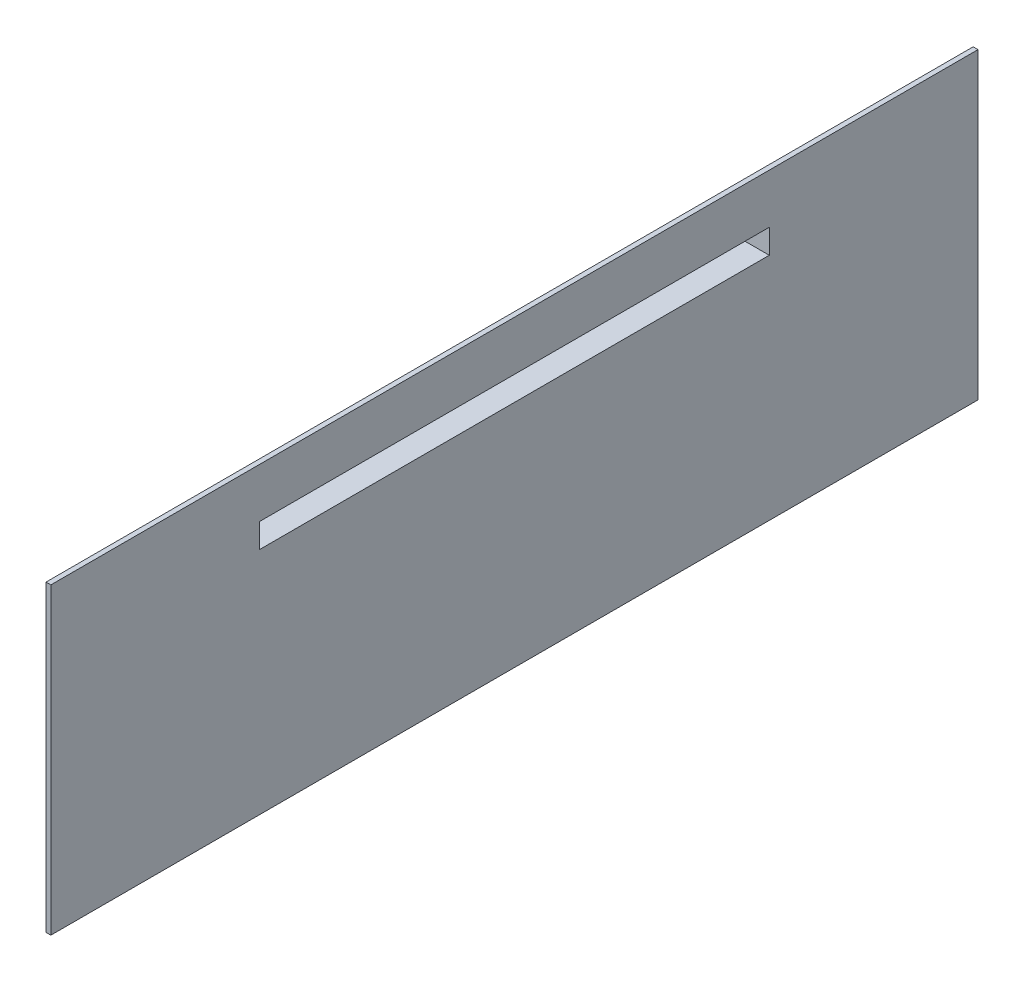
ISO-10303-21;
HEADER;
FILE_DESCRIPTION(('STEP AP214'),'2;1');
FILE_NAME('part.step','',(''),(''),'','','');
FILE_SCHEMA(('AUTOMOTIVE_DESIGN { 1 0 10303 214 1 1 1 1 }'));
ENDSEC;
DATA;
#1=APPLICATION_CONTEXT('core data for automotive mechanical design processes');
#2=APPLICATION_PROTOCOL_DEFINITION('international standard','automotive_design',2000,#1);
#3=PRODUCT_CONTEXT('',#1,'mechanical');
#4=PRODUCT('Part','Part','',(#3));
#5=PRODUCT_RELATED_PRODUCT_CATEGORY('part','',(#4));
#6=PRODUCT_DEFINITION_FORMATION('','',#4);
#7=PRODUCT_DEFINITION_CONTEXT('part definition',#1,'design');
#8=PRODUCT_DEFINITION('design','',#6,#7);
#9=PRODUCT_DEFINITION_SHAPE('','',#8);
#10=(LENGTH_UNIT() NAMED_UNIT(*) SI_UNIT(.MILLI.,.METRE.));
#11=(NAMED_UNIT(*) PLANE_ANGLE_UNIT() SI_UNIT($,.RADIAN.));
#12=(NAMED_UNIT(*) SI_UNIT($,.STERADIAN.) SOLID_ANGLE_UNIT());
#13=UNCERTAINTY_MEASURE_WITH_UNIT(LENGTH_MEASURE(1.E-05),#10,'distance_accuracy_value','');
#14=(GEOMETRIC_REPRESENTATION_CONTEXT(3) GLOBAL_UNCERTAINTY_ASSIGNED_CONTEXT((#13)) GLOBAL_UNIT_ASSIGNED_CONTEXT((#10,
#11,#12)) REPRESENTATION_CONTEXT('',''));
#15=CARTESIAN_POINT('',(0.,0.,0.));
#16=DIRECTION('',(0.,0.,1.));
#17=DIRECTION('',(1.,0.,0.));
#18=AXIS2_PLACEMENT_3D('',#15,#16,#17);
#19=CARTESIAN_POINT('',(532.,0.,0.));
#20=DIRECTION('',(-1.,0.,0.));
#21=DIRECTION('',(0.,0.,1.));
#22=AXIS2_PLACEMENT_3D('',#19,#20,#21);
#23=PLANE('',#22);
#24=DIRECTION('',(0.,0.,1.));
#25=VECTOR('',#24,1.);
#26=CARTESIAN_POINT('',(532.,-75.,-382.));
#27=LINE('',#26,#25);
#28=CARTESIAN_POINT('',(532.,-75.,-382.));
#29=VERTEX_POINT('',#28);
#30=CARTESIAN_POINT('',(532.,-75.,0.));
#31=VERTEX_POINT('',#30);
#32=EDGE_CURVE('E191',#29,#31,#27,.T.);
#33=ORIENTED_EDGE('',*,*,#32,.T.);
#34=DIRECTION('',(0.,1.,0.));
#35=VECTOR('',#34,1.);
#36=CARTESIAN_POINT('',(532.,-75.,0.));
#37=LINE('',#36,#35);
#38=CARTESIAN_POINT('',(532.,50.,0.));
#39=VERTEX_POINT('',#38);
#40=EDGE_CURVE('E207',#31,#39,#37,.T.);
#41=ORIENTED_EDGE('',*,*,#40,.T.);
#42=DIRECTION('',(0.,0.,-1.));
#43=VECTOR('',#42,1.);
#44=CARTESIAN_POINT('',(532.,50.,0.));
#45=LINE('',#44,#43);
#46=CARTESIAN_POINT('',(532.,50.,-382.));
#47=VERTEX_POINT('',#46);
#48=EDGE_CURVE('E210',#39,#47,#45,.T.);
#49=ORIENTED_EDGE('',*,*,#48,.T.);
#50=DIRECTION('',(0.,-1.,0.));
#51=VECTOR('',#50,1.);
#52=CARTESIAN_POINT('',(532.,50.,-382.));
#53=LINE('',#52,#51);
#54=EDGE_CURVE('E196',#47,#29,#53,.T.);
#55=ORIENTED_EDGE('',*,*,#54,.T.);
#56=EDGE_LOOP('',(#33,#41,#49,#55));
#57=FACE_BOUND('',#56,.T.);
#58=DIRECTION('',(0.,-1.,0.));
#59=VECTOR('',#58,1.);
#60=CARTESIAN_POINT('',(532.,16.6136570588009,-299.));
#61=LINE('',#60,#59);
#62=CARTESIAN_POINT('',(532.,32.6136570588009,-299.));
#63=VERTEX_POINT('',#62);
#64=CARTESIAN_POINT('',(532.,16.6136570588009,-299.));
#65=VERTEX_POINT('',#64);
#66=EDGE_CURVE('E176',#63,#65,#61,.T.);
#67=ORIENTED_EDGE('',*,*,#66,.F.);
#68=DIRECTION('',(0.,0.,-1.));
#69=VECTOR('',#68,1.);
#70=CARTESIAN_POINT('',(532.,32.6136570588009,-299.));
#71=LINE('',#70,#69);
#72=CARTESIAN_POINT('',(532.,32.6136570588009,-83.));
#73=VERTEX_POINT('',#72);
#74=EDGE_CURVE('E159',#73,#63,#71,.T.);
#75=ORIENTED_EDGE('',*,*,#74,.F.);
#76=DIRECTION('',(0.,1.,0.));
#77=VECTOR('',#76,1.);
#78=CARTESIAN_POINT('',(532.,32.6136570588009,-83.));
#79=LINE('',#78,#77);
#80=CARTESIAN_POINT('',(532.,16.6136570588009,-83.));
#81=VERTEX_POINT('',#80);
#82=EDGE_CURVE('E167',#81,#73,#79,.T.);
#83=ORIENTED_EDGE('',*,*,#82,.F.);
#84=DIRECTION('',(0.,0.,1.));
#85=VECTOR('',#84,1.);
#86=CARTESIAN_POINT('',(532.,16.6136570588009,-83.));
#87=LINE('',#86,#85);
#88=EDGE_CURVE('E178',#65,#81,#87,.T.);
#89=ORIENTED_EDGE('',*,*,#88,.F.);
#90=EDGE_LOOP('',(#67,#75,#83,#89));
#91=FACE_BOUND('',#90,.T.);
#92=ADVANCED_FACE('F36',(#57,#91),#23,.T.);
#93=CARTESIAN_POINT('',(534.,-75.,-382.));
#94=DIRECTION('',(0.,-1.,0.));
#95=DIRECTION('',(0.,0.,-1.));
#96=AXIS2_PLACEMENT_3D('',#93,#94,#95);
#97=PLANE('',#96);
#98=ORIENTED_EDGE('',*,*,#32,.F.);
#99=DIRECTION('',(-1.,0.,0.));
#100=VECTOR('',#99,1.);
#101=CARTESIAN_POINT('',(534.,-75.,-382.));
#102=LINE('',#101,#100);
#103=CARTESIAN_POINT('',(534.,-75.,-382.));
#104=VERTEX_POINT('',#103);
#105=EDGE_CURVE('E11',#104,#29,#102,.T.);
#106=ORIENTED_EDGE('',*,*,#105,.F.);
#107=DIRECTION('',(0.,0.,1.));
#108=VECTOR('',#107,1.);
#109=CARTESIAN_POINT('',(534.,-75.,-382.));
#110=LINE('',#109,#108);
#111=CARTESIAN_POINT('',(534.,-75.,0.));
#112=VERTEX_POINT('',#111);
#113=EDGE_CURVE('E192',#104,#112,#110,.T.);
#114=ORIENTED_EDGE('',*,*,#113,.T.);
#115=DIRECTION('',(-1.,0.,0.));
#116=VECTOR('',#115,1.);
#117=CARTESIAN_POINT('',(534.,-75.,0.));
#118=LINE('',#117,#116);
#119=EDGE_CURVE('E40',#112,#31,#118,.T.);
#120=ORIENTED_EDGE('',*,*,#119,.T.);
#121=EDGE_LOOP('',(#98,#106,#114,#120));
#122=FACE_BOUND('',#121,.T.);
#123=ADVANCED_FACE('F38',(#122),#97,.T.);
#124=CARTESIAN_POINT('',(534.,50.,-382.));
#125=DIRECTION('',(0.,0.,-1.));
#126=DIRECTION('',(-1.,0.,0.));
#127=AXIS2_PLACEMENT_3D('',#124,#125,#126);
#128=PLANE('',#127);
#129=ORIENTED_EDGE('',*,*,#54,.F.);
#130=DIRECTION('',(-1.,0.,0.));
#131=VECTOR('',#130,1.);
#132=CARTESIAN_POINT('',(534.,50.,-382.));
#133=LINE('',#132,#131);
#134=CARTESIAN_POINT('',(534.,50.,-382.));
#135=VERTEX_POINT('',#134);
#136=EDGE_CURVE('E45',#135,#47,#133,.T.);
#137=ORIENTED_EDGE('',*,*,#136,.F.);
#138=DIRECTION('',(0.,-1.,0.));
#139=VECTOR('',#138,1.);
#140=CARTESIAN_POINT('',(534.,50.,-382.));
#141=LINE('',#140,#139);
#142=EDGE_CURVE('E202',#135,#104,#141,.T.);
#143=ORIENTED_EDGE('',*,*,#142,.T.);
#144=ORIENTED_EDGE('',*,*,#105,.T.);
#145=EDGE_LOOP('',(#129,#137,#143,#144));
#146=FACE_BOUND('',#145,.T.);
#147=ADVANCED_FACE('F228',(#146),#128,.T.);
#148=CARTESIAN_POINT('',(534.,50.,0.));
#149=DIRECTION('',(0.,1.,0.));
#150=DIRECTION('',(0.,0.,1.));
#151=AXIS2_PLACEMENT_3D('',#148,#149,#150);
#152=PLANE('',#151);
#153=ORIENTED_EDGE('',*,*,#48,.F.);
#154=DIRECTION('',(-1.,0.,0.));
#155=VECTOR('',#154,1.);
#156=CARTESIAN_POINT('',(534.,50.,0.));
#157=LINE('',#156,#155);
#158=CARTESIAN_POINT('',(534.,50.,0.));
#159=VERTEX_POINT('',#158);
#160=EDGE_CURVE('E215',#159,#39,#157,.T.);
#161=ORIENTED_EDGE('',*,*,#160,.F.);
#162=DIRECTION('',(0.,0.,-1.));
#163=VECTOR('',#162,1.);
#164=CARTESIAN_POINT('',(534.,50.,0.));
#165=LINE('',#164,#163);
#166=EDGE_CURVE('E199',#159,#135,#165,.T.);
#167=ORIENTED_EDGE('',*,*,#166,.T.);
#168=ORIENTED_EDGE('',*,*,#136,.T.);
#169=EDGE_LOOP('',(#153,#161,#167,#168));
#170=FACE_BOUND('',#169,.T.);
#171=ADVANCED_FACE('F232',(#170),#152,.T.);
#172=CARTESIAN_POINT('',(534.,-75.,0.));
#173=DIRECTION('',(0.,0.,1.));
#174=DIRECTION('',(1.,0.,0.));
#175=AXIS2_PLACEMENT_3D('',#172,#173,#174);
#176=PLANE('',#175);
#177=ORIENTED_EDGE('',*,*,#40,.F.);
#178=ORIENTED_EDGE('',*,*,#119,.F.);
#179=DIRECTION('',(0.,1.,0.));
#180=VECTOR('',#179,1.);
#181=CARTESIAN_POINT('',(534.,-75.,0.));
#182=LINE('',#181,#180);
#183=EDGE_CURVE('E195',#112,#159,#182,.T.);
#184=ORIENTED_EDGE('',*,*,#183,.T.);
#185=ORIENTED_EDGE('',*,*,#160,.T.);
#186=EDGE_LOOP('',(#177,#178,#184,#185));
#187=FACE_BOUND('',#186,.T.);
#188=ADVANCED_FACE('F223',(#187),#176,.T.);
#189=CARTESIAN_POINT('',(534.,0.,0.));
#190=DIRECTION('',(-1.,0.,0.));
#191=DIRECTION('',(0.,0.,1.));
#192=AXIS2_PLACEMENT_3D('',#189,#190,#191);
#193=PLANE('',#192);
#194=DIRECTION('',(0.,1.,0.));
#195=VECTOR('',#194,1.);
#196=CARTESIAN_POINT('',(534.,19.6136570588009,-86.));
#197=LINE('',#196,#195);
#198=CARTESIAN_POINT('',(534.,19.6136570588009,-86.));
#199=VERTEX_POINT('',#198);
#200=CARTESIAN_POINT('',(534.,29.6136570588009,-86.));
#201=VERTEX_POINT('',#200);
#202=EDGE_CURVE('E134',#199,#201,#197,.T.);
#203=ORIENTED_EDGE('',*,*,#202,.T.);
#204=DIRECTION('',(0.,0.,-1.));
#205=VECTOR('',#204,1.);
#206=CARTESIAN_POINT('',(534.,29.6136570588009,-86.));
#207=LINE('',#206,#205);
#208=CARTESIAN_POINT('',(534.,29.6136570588009,-296.));
#209=VERTEX_POINT('',#208);
#210=EDGE_CURVE('E128',#201,#209,#207,.T.);
#211=ORIENTED_EDGE('',*,*,#210,.T.);
#212=DIRECTION('',(0.,-1.,0.));
#213=VECTOR('',#212,1.);
#214=CARTESIAN_POINT('',(534.,29.6136570588009,-296.));
#215=LINE('',#214,#213);
#216=CARTESIAN_POINT('',(534.,19.6136570588009,-296.));
#217=VERTEX_POINT('',#216);
#218=EDGE_CURVE('E137',#209,#217,#215,.T.);
#219=ORIENTED_EDGE('',*,*,#218,.T.);
#220=DIRECTION('',(0.,0.,1.));
#221=VECTOR('',#220,1.);
#222=CARTESIAN_POINT('',(534.,19.6136570588009,-296.));
#223=LINE('',#222,#221);
#224=EDGE_CURVE('E53',#217,#199,#223,.T.);
#225=ORIENTED_EDGE('',*,*,#224,.T.);
#226=EDGE_LOOP('',(#203,#211,#219,#225));
#227=FACE_BOUND('',#226,.T.);
#228=ORIENTED_EDGE('',*,*,#113,.F.);
#229=ORIENTED_EDGE('',*,*,#142,.F.);
#230=ORIENTED_EDGE('',*,*,#166,.F.);
#231=ORIENTED_EDGE('',*,*,#183,.F.);
#232=EDGE_LOOP('',(#228,#229,#230,#231));
#233=FACE_BOUND('',#232,.T.);
#234=ADVANCED_FACE('F141',(#227,#233),#193,.F.);
#235=CARTESIAN_POINT('',(522.,32.6136570588009,-299.));
#236=DIRECTION('',(0.,-1.,0.));
#237=DIRECTION('',(0.,0.,-1.));
#238=AXIS2_PLACEMENT_3D('',#235,#236,#237);
#239=PLANE('',#238);
#240=ORIENTED_EDGE('',*,*,#74,.T.);
#241=DIRECTION('',(1.,0.,0.));
#242=VECTOR('',#241,1.);
#243=CARTESIAN_POINT('',(522.,32.6136570588009,-299.));
#244=LINE('',#243,#242);
#245=CARTESIAN_POINT('',(522.,32.6136570588009,-299.));
#246=VERTEX_POINT('',#245);
#247=EDGE_CURVE('E189',#246,#63,#244,.T.);
#248=ORIENTED_EDGE('',*,*,#247,.F.);
#249=DIRECTION('',(0.,0.,-1.));
#250=VECTOR('',#249,1.);
#251=CARTESIAN_POINT('',(522.,32.6136570588009,-299.));
#252=LINE('',#251,#250);
#253=CARTESIAN_POINT('',(522.,32.6136570588009,-83.));
#254=VERTEX_POINT('',#253);
#255=EDGE_CURVE('E163',#254,#246,#252,.T.);
#256=ORIENTED_EDGE('',*,*,#255,.F.);
#257=DIRECTION('',(1.,0.,0.));
#258=VECTOR('',#257,1.);
#259=CARTESIAN_POINT('',(522.,32.6136570588009,-83.));
#260=LINE('',#259,#258);
#261=EDGE_CURVE('E173',#254,#73,#260,.T.);
#262=ORIENTED_EDGE('',*,*,#261,.T.);
#263=EDGE_LOOP('',(#240,#248,#256,#262));
#264=FACE_BOUND('',#263,.T.);
#265=ADVANCED_FACE('F248',(#264),#239,.F.);
#266=CARTESIAN_POINT('',(522.,16.6136570588009,-299.));
#267=DIRECTION('',(0.,0.,1.));
#268=DIRECTION('',(1.,0.,0.));
#269=AXIS2_PLACEMENT_3D('',#266,#267,#268);
#270=PLANE('',#269);
#271=ORIENTED_EDGE('',*,*,#66,.T.);
#272=DIRECTION('',(1.,0.,0.));
#273=VECTOR('',#272,1.);
#274=CARTESIAN_POINT('',(522.,16.6136570588009,-299.));
#275=LINE('',#274,#273);
#276=CARTESIAN_POINT('',(522.,16.6136570588009,-299.));
#277=VERTEX_POINT('',#276);
#278=EDGE_CURVE('E186',#277,#65,#275,.T.);
#279=ORIENTED_EDGE('',*,*,#278,.F.);
#280=DIRECTION('',(0.,-1.,0.));
#281=VECTOR('',#280,1.);
#282=CARTESIAN_POINT('',(522.,16.6136570588009,-299.));
#283=LINE('',#282,#281);
#284=EDGE_CURVE('E166',#246,#277,#283,.T.);
#285=ORIENTED_EDGE('',*,*,#284,.F.);
#286=ORIENTED_EDGE('',*,*,#247,.T.);
#287=EDGE_LOOP('',(#271,#279,#285,#286));
#288=FACE_BOUND('',#287,.T.);
#289=ADVANCED_FACE('F251',(#288),#270,.F.);
#290=CARTESIAN_POINT('',(522.,16.6136570588009,-83.));
#291=DIRECTION('',(0.,1.,0.));
#292=DIRECTION('',(0.,0.,1.));
#293=AXIS2_PLACEMENT_3D('',#290,#291,#292);
#294=PLANE('',#293);
#295=ORIENTED_EDGE('',*,*,#88,.T.);
#296=DIRECTION('',(1.,0.,0.));
#297=VECTOR('',#296,1.);
#298=CARTESIAN_POINT('',(522.,16.6136570588009,-83.));
#299=LINE('',#298,#297);
#300=CARTESIAN_POINT('',(522.,16.6136570588009,-83.));
#301=VERTEX_POINT('',#300);
#302=EDGE_CURVE('E184',#301,#81,#299,.T.);
#303=ORIENTED_EDGE('',*,*,#302,.F.);
#304=DIRECTION('',(0.,0.,1.));
#305=VECTOR('',#304,1.);
#306=CARTESIAN_POINT('',(522.,16.6136570588009,-83.));
#307=LINE('',#306,#305);
#308=EDGE_CURVE('E169',#277,#301,#307,.T.);
#309=ORIENTED_EDGE('',*,*,#308,.F.);
#310=ORIENTED_EDGE('',*,*,#278,.T.);
#311=EDGE_LOOP('',(#295,#303,#309,#310));
#312=FACE_BOUND('',#311,.T.);
#313=ADVANCED_FACE('F255',(#312),#294,.F.);
#314=CARTESIAN_POINT('',(522.,32.6136570588009,-83.));
#315=DIRECTION('',(0.,0.,-1.));
#316=DIRECTION('',(0.,1.,0.));
#317=AXIS2_PLACEMENT_3D('',#314,#315,#316);
#318=PLANE('',#317);
#319=ORIENTED_EDGE('',*,*,#82,.T.);
#320=ORIENTED_EDGE('',*,*,#261,.F.);
#321=DIRECTION('',(0.,1.,0.));
#322=VECTOR('',#321,1.);
#323=CARTESIAN_POINT('',(522.,32.6136570588009,-83.));
#324=LINE('',#323,#322);
#325=EDGE_CURVE('E171',#301,#254,#324,.T.);
#326=ORIENTED_EDGE('',*,*,#325,.F.);
#327=ORIENTED_EDGE('',*,*,#302,.T.);
#328=EDGE_LOOP('',(#319,#320,#326,#327));
#329=FACE_BOUND('',#328,.T.);
#330=ADVANCED_FACE('F259',(#329),#318,.F.);
#331=CARTESIAN_POINT('',(522.,0.,0.));
#332=DIRECTION('',(1.,0.,0.));
#333=DIRECTION('',(0.,0.,-1.));
#334=AXIS2_PLACEMENT_3D('',#331,#332,#333);
#335=PLANE('',#334);
#336=DIRECTION('',(0.,-1.,0.));
#337=VECTOR('',#336,1.);
#338=CARTESIAN_POINT('',(522.,29.6136570588009,-296.));
#339=LINE('',#338,#337);
#340=CARTESIAN_POINT('',(522.,29.6136570588009,-296.));
#341=VERTEX_POINT('',#340);
#342=CARTESIAN_POINT('',(522.,19.6136570588009,-296.));
#343=VERTEX_POINT('',#342);
#344=EDGE_CURVE('E153',#341,#343,#339,.T.);
#345=ORIENTED_EDGE('',*,*,#344,.F.);
#346=DIRECTION('',(0.,0.,-1.));
#347=VECTOR('',#346,1.);
#348=CARTESIAN_POINT('',(522.,29.6136570588009,-86.));
#349=LINE('',#348,#347);
#350=CARTESIAN_POINT('',(522.,29.6136570588009,-86.));
#351=VERTEX_POINT('',#350);
#352=EDGE_CURVE('E61',#351,#341,#349,.T.);
#353=ORIENTED_EDGE('',*,*,#352,.F.);
#354=DIRECTION('',(0.,1.,0.));
#355=VECTOR('',#354,1.);
#356=CARTESIAN_POINT('',(522.,19.6136570588009,-86.));
#357=LINE('',#356,#355);
#358=CARTESIAN_POINT('',(522.,19.6136570588009,-86.));
#359=VERTEX_POINT('',#358);
#360=EDGE_CURVE('E144',#359,#351,#357,.T.);
#361=ORIENTED_EDGE('',*,*,#360,.F.);
#362=DIRECTION('',(0.,0.,1.));
#363=VECTOR('',#362,1.);
#364=CARTESIAN_POINT('',(522.,19.6136570588009,-296.));
#365=LINE('',#364,#363);
#366=EDGE_CURVE('E147',#343,#359,#365,.T.);
#367=ORIENTED_EDGE('',*,*,#366,.F.);
#368=EDGE_LOOP('',(#345,#353,#361,#367));
#369=FACE_BOUND('',#368,.T.);
#370=ORIENTED_EDGE('',*,*,#255,.T.);
#371=ORIENTED_EDGE('',*,*,#284,.T.);
#372=ORIENTED_EDGE('',*,*,#308,.T.);
#373=ORIENTED_EDGE('',*,*,#325,.T.);
#374=EDGE_LOOP('',(#370,#371,#372,#373));
#375=FACE_BOUND('',#374,.T.);
#376=ADVANCED_FACE('F263',(#369,#375),#335,.F.);
#377=CARTESIAN_POINT('',(534.,29.6136570588009,-86.));
#378=DIRECTION('',(0.,1.,0.));
#379=DIRECTION('',(0.,0.,1.));
#380=AXIS2_PLACEMENT_3D('',#377,#378,#379);
#381=PLANE('',#380);
#382=ORIENTED_EDGE('',*,*,#352,.T.);
#383=DIRECTION('',(-1.,0.,0.));
#384=VECTOR('',#383,1.);
#385=CARTESIAN_POINT('',(534.,29.6136570588009,-296.));
#386=LINE('',#385,#384);
#387=EDGE_CURVE('E124',#209,#341,#386,.T.);
#388=ORIENTED_EDGE('',*,*,#387,.F.);
#389=ORIENTED_EDGE('',*,*,#210,.F.);
#390=DIRECTION('',(-1.,0.,0.));
#391=VECTOR('',#390,1.);
#392=CARTESIAN_POINT('',(534.,29.6136570588009,-86.));
#393=LINE('',#392,#391);
#394=EDGE_CURVE('E157',#201,#351,#393,.T.);
#395=ORIENTED_EDGE('',*,*,#394,.T.);
#396=EDGE_LOOP('',(#382,#388,#389,#395));
#397=FACE_BOUND('',#396,.T.);
#398=ADVANCED_FACE('F126',(#397),#381,.F.);
#399=CARTESIAN_POINT('',(534.,19.6136570588009,-86.));
#400=DIRECTION('',(0.,0.,1.));
#401=DIRECTION('',(1.,0.,0.));
#402=AXIS2_PLACEMENT_3D('',#399,#400,#401);
#403=PLANE('',#402);
#404=ORIENTED_EDGE('',*,*,#360,.T.);
#405=ORIENTED_EDGE('',*,*,#394,.F.);
#406=ORIENTED_EDGE('',*,*,#202,.F.);
#407=DIRECTION('',(-1.,0.,0.));
#408=VECTOR('',#407,1.);
#409=CARTESIAN_POINT('',(534.,19.6136570588009,-86.));
#410=LINE('',#409,#408);
#411=EDGE_CURVE('E160',#199,#359,#410,.T.);
#412=ORIENTED_EDGE('',*,*,#411,.T.);
#413=EDGE_LOOP('',(#404,#405,#406,#412));
#414=FACE_BOUND('',#413,.T.);
#415=ADVANCED_FACE('F270',(#414),#403,.F.);
#416=CARTESIAN_POINT('',(534.,19.6136570588009,-296.));
#417=DIRECTION('',(0.,-1.,0.));
#418=DIRECTION('',(0.,0.,-1.));
#419=AXIS2_PLACEMENT_3D('',#416,#417,#418);
#420=PLANE('',#419);
#421=ORIENTED_EDGE('',*,*,#366,.T.);
#422=ORIENTED_EDGE('',*,*,#411,.F.);
#423=ORIENTED_EDGE('',*,*,#224,.F.);
#424=DIRECTION('',(-1.,0.,0.));
#425=VECTOR('',#424,1.);
#426=CARTESIAN_POINT('',(534.,19.6136570588009,-296.));
#427=LINE('',#426,#425);
#428=EDGE_CURVE('E133',#217,#343,#427,.T.);
#429=ORIENTED_EDGE('',*,*,#428,.T.);
#430=EDGE_LOOP('',(#421,#422,#423,#429));
#431=FACE_BOUND('',#430,.T.);
#432=ADVANCED_FACE('F273',(#431),#420,.F.);
#433=CARTESIAN_POINT('',(534.,29.6136570588009,-296.));
#434=DIRECTION('',(0.,0.,-1.));
#435=DIRECTION('',(-1.,0.,0.));
#436=AXIS2_PLACEMENT_3D('',#433,#434,#435);
#437=PLANE('',#436);
#438=ORIENTED_EDGE('',*,*,#344,.T.);
#439=ORIENTED_EDGE('',*,*,#428,.F.);
#440=ORIENTED_EDGE('',*,*,#218,.F.);
#441=ORIENTED_EDGE('',*,*,#387,.T.);
#442=EDGE_LOOP('',(#438,#439,#440,#441));
#443=FACE_BOUND('',#442,.T.);
#444=ADVANCED_FACE('F138',(#443),#437,.F.);
#445=CLOSED_SHELL('',(#92,#123,#147,#171,#188,#234,#265,#289,#313,#330,#376,#398,#415,#432,#444));
#446=MANIFOLD_SOLID_BREP('B2',#445);
#447=ADVANCED_BREP_SHAPE_REPRESENTATION('',(#18,#446),#14);
#448=SHAPE_DEFINITION_REPRESENTATION(#9,#447);
ENDSEC;
END-ISO-10303-21;
